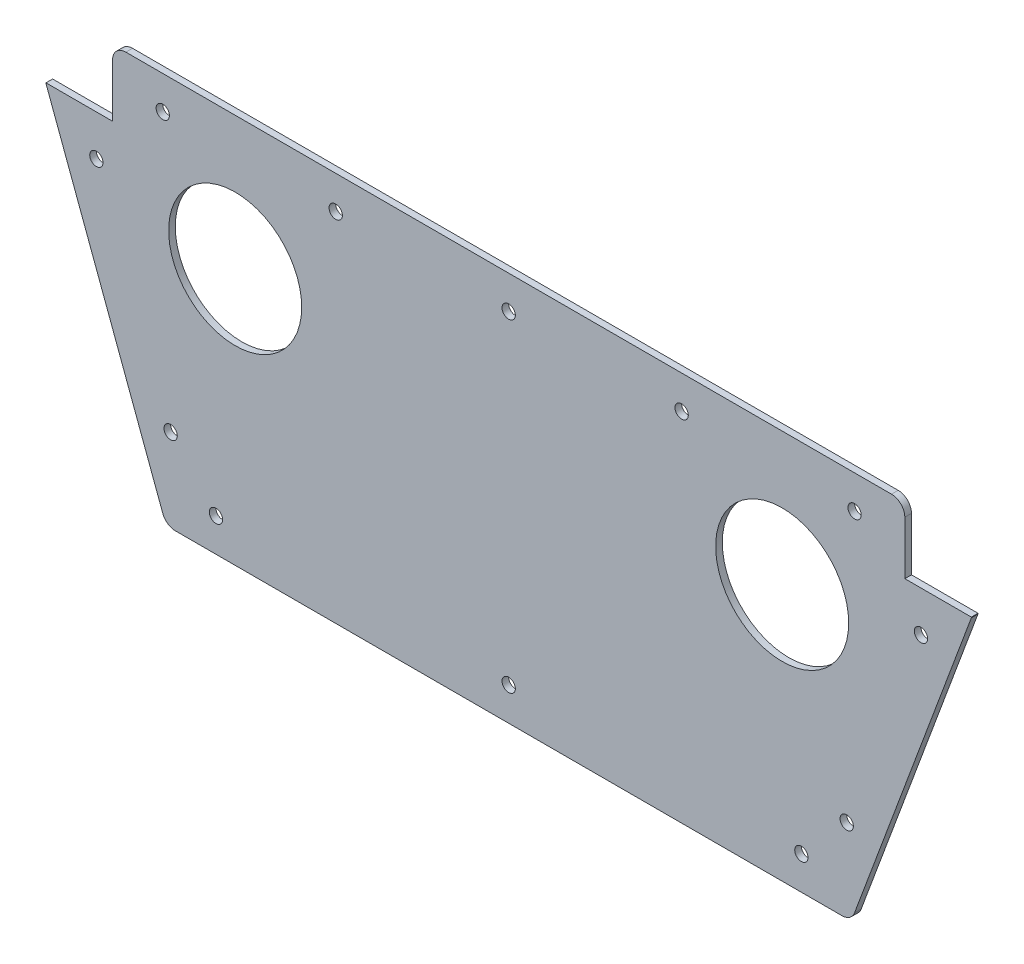
ISO-10303-21;
HEADER;
FILE_DESCRIPTION(('STEP AP214'),'2;1');
FILE_NAME('part.step','',(''),(''),'','','');
FILE_SCHEMA(('AUTOMOTIVE_DESIGN { 1 0 10303 214 1 1 1 1 }'));
ENDSEC;
DATA;
#1=APPLICATION_CONTEXT('core data for automotive mechanical design processes');
#2=APPLICATION_PROTOCOL_DEFINITION('international standard','automotive_design',2000,#1);
#3=PRODUCT_CONTEXT('',#1,'mechanical');
#4=PRODUCT('Part','Part','',(#3));
#5=PRODUCT_RELATED_PRODUCT_CATEGORY('part','',(#4));
#6=PRODUCT_DEFINITION_FORMATION('','',#4);
#7=PRODUCT_DEFINITION_CONTEXT('part definition',#1,'design');
#8=PRODUCT_DEFINITION('design','',#6,#7);
#9=PRODUCT_DEFINITION_SHAPE('','',#8);
#10=(LENGTH_UNIT() NAMED_UNIT(*) SI_UNIT(.MILLI.,.METRE.));
#11=(NAMED_UNIT(*) PLANE_ANGLE_UNIT() SI_UNIT($,.RADIAN.));
#12=(NAMED_UNIT(*) SI_UNIT($,.STERADIAN.) SOLID_ANGLE_UNIT());
#13=UNCERTAINTY_MEASURE_WITH_UNIT(LENGTH_MEASURE(1.E-05),#10,'distance_accuracy_value','');
#14=(GEOMETRIC_REPRESENTATION_CONTEXT(3) GLOBAL_UNCERTAINTY_ASSIGNED_CONTEXT((#13)) GLOBAL_UNIT_ASSIGNED_CONTEXT((#10,
#11,#12)) REPRESENTATION_CONTEXT('',''));
#15=CARTESIAN_POINT('',(0.,0.,0.));
#16=DIRECTION('',(0.,0.,1.));
#17=DIRECTION('',(1.,0.,0.));
#18=AXIS2_PLACEMENT_3D('',#15,#16,#17);
#19=CARTESIAN_POINT('',(-69.55,28.5,-1.));
#20=DIRECTION('',(-1.,0.,0.));
#21=DIRECTION('',(0.,0.,1.));
#22=AXIS2_PLACEMENT_3D('',#19,#20,#21);
#23=PLANE('',#22);
#24=DIRECTION('',(0.,0.,1.));
#25=VECTOR('',#24,1.);
#26=CARTESIAN_POINT('',(-69.55,28.6,-2.));
#27=LINE('',#26,#25);
#28=CARTESIAN_POINT('',(-69.55,28.6,-1.));
#29=VERTEX_POINT('',#28);
#30=CARTESIAN_POINT('',(-69.55,28.6,0.));
#31=VERTEX_POINT('',#30);
#32=EDGE_CURVE('E175',#29,#31,#27,.T.);
#33=ORIENTED_EDGE('',*,*,#32,.F.);
#34=DIRECTION('',(0.,-1.,0.));
#35=VECTOR('',#34,1.);
#36=CARTESIAN_POINT('',(-69.55,28.5,-1.));
#37=LINE('',#36,#35);
#38=CARTESIAN_POINT('',(-69.55,28.5,-1.));
#39=VERTEX_POINT('',#38);
#40=EDGE_CURVE('E256',#29,#39,#37,.T.);
#41=ORIENTED_EDGE('',*,*,#40,.T.);
#42=DIRECTION('',(0.,0.,1.));
#43=VECTOR('',#42,1.);
#44=CARTESIAN_POINT('',(-69.55,28.5,-1.));
#45=LINE('',#44,#43);
#46=CARTESIAN_POINT('',(-69.55,28.5,0.));
#47=VERTEX_POINT('',#46);
#48=EDGE_CURVE('E272',#39,#47,#45,.T.);
#49=ORIENTED_EDGE('',*,*,#48,.T.);
#50=DIRECTION('',(0.,-1.,0.));
#51=VECTOR('',#50,1.);
#52=CARTESIAN_POINT('',(-69.55,28.5,0.));
#53=LINE('',#52,#51);
#54=EDGE_CURVE('E255',#31,#47,#53,.T.);
#55=ORIENTED_EDGE('',*,*,#54,.F.);
#56=EDGE_LOOP('',(#33,#41,#49,#55));
#57=FACE_BOUND('',#56,.T.);
#58=ADVANCED_FACE('F36',(#57),#23,.T.);
#59=CARTESIAN_POINT('',(-69.55,38.6,-1.));
#60=DIRECTION('',(0.,1.,0.));
#61=DIRECTION('',(0.,0.,1.));
#62=AXIS2_PLACEMENT_3D('',#59,#60,#61);
#63=PLANE('',#62);
#64=DIRECTION('',(-1.,0.,0.));
#65=VECTOR('',#64,1.);
#66=CARTESIAN_POINT('',(-69.55,38.6,-1.));
#67=LINE('',#66,#65);
#68=CARTESIAN_POINT('',(57.55,38.6,-1.));
#69=VERTEX_POINT('',#68);
#70=CARTESIAN_POINT('',(-57.55,38.6,-1.));
#71=VERTEX_POINT('',#70);
#72=EDGE_CURVE('E269',#69,#71,#67,.T.);
#73=ORIENTED_EDGE('',*,*,#72,.T.);
#74=DIRECTION('',(0.,0.,1.));
#75=VECTOR('',#74,1.);
#76=CARTESIAN_POINT('',(-57.55,38.6,0.));
#77=LINE('',#76,#75);
#78=CARTESIAN_POINT('',(-57.55,38.6,0.));
#79=VERTEX_POINT('',#78);
#80=EDGE_CURVE('E291',#71,#79,#77,.T.);
#81=ORIENTED_EDGE('',*,*,#80,.T.);
#82=DIRECTION('',(-1.,0.,0.));
#83=VECTOR('',#82,1.);
#84=CARTESIAN_POINT('',(-69.55,38.6,0.));
#85=LINE('',#84,#83);
#86=CARTESIAN_POINT('',(57.55,38.6,0.));
#87=VERTEX_POINT('',#86);
#88=EDGE_CURVE('E259',#87,#79,#85,.T.);
#89=ORIENTED_EDGE('',*,*,#88,.F.);
#90=DIRECTION('',(0.,0.,1.));
#91=VECTOR('',#90,1.);
#92=CARTESIAN_POINT('',(57.55,38.6,-1.));
#93=LINE('',#92,#91);
#94=EDGE_CURVE('E287',#87,#69,#93,.F.);
#95=ORIENTED_EDGE('',*,*,#94,.T.);
#96=EDGE_LOOP('',(#73,#81,#89,#95));
#97=FACE_BOUND('',#96,.T.);
#98=ADVANCED_FACE('F360',(#97),#63,.T.);
#99=CARTESIAN_POINT('',(69.55,38.6,-1.));
#100=DIRECTION('',(1.,0.,0.));
#101=DIRECTION('',(0.,1.,0.));
#102=AXIS2_PLACEMENT_3D('',#99,#100,#101);
#103=PLANE('',#102);
#104=DIRECTION('',(0.,0.,1.));
#105=VECTOR('',#104,1.);
#106=CARTESIAN_POINT('',(69.55,28.6,-2.));
#107=LINE('',#106,#105);
#108=CARTESIAN_POINT('',(69.55,28.6,-1.));
#109=VERTEX_POINT('',#108);
#110=CARTESIAN_POINT('',(69.55,28.6,0.));
#111=VERTEX_POINT('',#110);
#112=EDGE_CURVE('E155',#109,#111,#107,.T.);
#113=ORIENTED_EDGE('',*,*,#112,.T.);
#114=DIRECTION('',(0.,1.,0.));
#115=VECTOR('',#114,1.);
#116=CARTESIAN_POINT('',(69.55,38.6,0.));
#117=LINE('',#116,#115);
#118=CARTESIAN_POINT('',(69.55,28.5,0.));
#119=VERTEX_POINT('',#118);
#120=EDGE_CURVE('E161',#119,#111,#117,.T.);
#121=ORIENTED_EDGE('',*,*,#120,.F.);
#122=DIRECTION('',(0.,0.,1.));
#123=VECTOR('',#122,1.);
#124=CARTESIAN_POINT('',(69.55,28.5,-1.));
#125=LINE('',#124,#123);
#126=CARTESIAN_POINT('',(69.55,28.5,-1.));
#127=VERTEX_POINT('',#126);
#128=EDGE_CURVE('E284',#127,#119,#125,.T.);
#129=ORIENTED_EDGE('',*,*,#128,.F.);
#130=DIRECTION('',(0.,1.,0.));
#131=VECTOR('',#130,1.);
#132=CARTESIAN_POINT('',(69.55,38.6,-1.));
#133=LINE('',#132,#131);
#134=EDGE_CURVE('E266',#127,#109,#133,.T.);
#135=ORIENTED_EDGE('',*,*,#134,.T.);
#136=EDGE_LOOP('',(#113,#121,#129,#135));
#137=FACE_BOUND('',#136,.T.);
#138=ADVANCED_FACE('F373',(#137),#103,.T.);
#139=CARTESIAN_POINT('',(69.55,28.5,-1.));
#140=DIRECTION('',(0.937199817406599,-0.348792921735858,0.));
#141=DIRECTION('',(0.348792921735858,0.937199817406599,0.));
#142=AXIS2_PLACEMENT_3D('',#139,#140,#141);
#143=PLANE('',#142);
#144=DIRECTION('',(0.348792921735858,0.937199817406599,0.));
#145=VECTOR('',#144,1.);
#146=CARTESIAN_POINT('',(69.55,28.5,0.));
#147=LINE('',#146,#145);
#148=CARTESIAN_POINT('',(51.9847128974296,-18.6975858434717,0.));
#149=VERTEX_POINT('',#148);
#150=EDGE_CURVE('E280',#149,#119,#147,.T.);
#151=ORIENTED_EDGE('',*,*,#150,.F.);
#152=DIRECTION('',(0.,0.,1.));
#153=VECTOR('',#152,1.);
#154=CARTESIAN_POINT('',(51.9847128974296,-18.6975858434717,-1.));
#155=LINE('',#154,#153);
#156=CARTESIAN_POINT('',(51.9847128974296,-18.6975858434717,-1.));
#157=VERTEX_POINT('',#156);
#158=EDGE_CURVE('E44',#149,#157,#155,.F.);
#159=ORIENTED_EDGE('',*,*,#158,.T.);
#160=DIRECTION('',(0.348792921735858,0.937199817406599,0.));
#161=VECTOR('',#160,1.);
#162=CARTESIAN_POINT('',(69.55,28.5,-1.));
#163=LINE('',#162,#161);
#164=EDGE_CURVE('E264',#157,#127,#163,.T.);
#165=ORIENTED_EDGE('',*,*,#164,.T.);
#166=ORIENTED_EDGE('',*,*,#128,.T.);
#167=EDGE_LOOP('',(#151,#159,#165,#166));
#168=FACE_BOUND('',#167,.T.);
#169=ADVANCED_FACE('F321',(#168),#143,.T.);
#170=CARTESIAN_POINT('',(51.5,-20.,-1.));
#171=DIRECTION('',(0.,-1.,0.));
#172=DIRECTION('',(1.,0.,0.));
#173=AXIS2_PLACEMENT_3D('',#170,#171,#172);
#174=PLANE('',#173);
#175=DIRECTION('',(1.,0.,0.));
#176=VECTOR('',#175,1.);
#177=CARTESIAN_POINT('',(51.5,-20.,0.));
#178=LINE('',#177,#176);
#179=CARTESIAN_POINT('',(-50.1103132626164,-20.,0.));
#180=VERTEX_POINT('',#179);
#181=CARTESIAN_POINT('',(50.1103132626164,-20.,0.));
#182=VERTEX_POINT('',#181);
#183=EDGE_CURVE('E277',#180,#182,#178,.T.);
#184=ORIENTED_EDGE('',*,*,#183,.F.);
#185=DIRECTION('',(0.,0.,1.));
#186=VECTOR('',#185,1.);
#187=CARTESIAN_POINT('',(-50.1103132626164,-20.,-1.));
#188=LINE('',#187,#186);
#189=CARTESIAN_POINT('',(-50.1103132626164,-20.,-1.));
#190=VERTEX_POINT('',#189);
#191=EDGE_CURVE('E316',#180,#190,#188,.F.);
#192=ORIENTED_EDGE('',*,*,#191,.T.);
#193=DIRECTION('',(1.,0.,0.));
#194=VECTOR('',#193,1.);
#195=CARTESIAN_POINT('',(51.5,-20.,-1.));
#196=LINE('',#195,#194);
#197=CARTESIAN_POINT('',(50.1103132626164,-20.,-1.));
#198=VERTEX_POINT('',#197);
#199=EDGE_CURVE('E261',#190,#198,#196,.T.);
#200=ORIENTED_EDGE('',*,*,#199,.T.);
#201=DIRECTION('',(0.,0.,1.));
#202=VECTOR('',#201,1.);
#203=CARTESIAN_POINT('',(50.1103132626164,-20.,-1.));
#204=LINE('',#203,#202);
#205=EDGE_CURVE('E313',#198,#182,#204,.T.);
#206=ORIENTED_EDGE('',*,*,#205,.T.);
#207=EDGE_LOOP('',(#184,#192,#200,#206));
#208=FACE_BOUND('',#207,.T.);
#209=ADVANCED_FACE('F333',(#208),#174,.T.);
#210=CARTESIAN_POINT('',(-51.5,-20.,-1.));
#211=DIRECTION('',(-0.937199817406599,-0.348792921735858,0.));
#212=DIRECTION('',(0.348792921735858,-0.9371998174066,0.));
#213=AXIS2_PLACEMENT_3D('',#210,#211,#212);
#214=PLANE('',#213);
#215=DIRECTION('',(0.348792921735858,-0.937199817406599,0.));
#216=VECTOR('',#215,1.);
#217=CARTESIAN_POINT('',(-51.5,-20.,-1.));
#218=LINE('',#217,#216);
#219=CARTESIAN_POINT('',(-51.9847128974296,-18.6975858434717,-1.));
#220=VERTEX_POINT('',#219);
#221=EDGE_CURVE('E258',#39,#220,#218,.T.);
#222=ORIENTED_EDGE('',*,*,#221,.T.);
#223=DIRECTION('',(0.,0.,1.));
#224=VECTOR('',#223,1.);
#225=CARTESIAN_POINT('',(-51.9847128974296,-18.6975858434717,-1.));
#226=LINE('',#225,#224);
#227=CARTESIAN_POINT('',(-51.9847128974296,-18.6975858434717,0.));
#228=VERTEX_POINT('',#227);
#229=EDGE_CURVE('E310',#220,#228,#226,.T.);
#230=ORIENTED_EDGE('',*,*,#229,.T.);
#231=DIRECTION('',(0.348792921735858,-0.937199817406599,0.));
#232=VECTOR('',#231,1.);
#233=CARTESIAN_POINT('',(-51.5,-20.,0.));
#234=LINE('',#233,#232);
#235=EDGE_CURVE('E274',#47,#228,#234,.T.);
#236=ORIENTED_EDGE('',*,*,#235,.F.);
#237=ORIENTED_EDGE('',*,*,#48,.F.);
#238=EDGE_LOOP('',(#222,#230,#236,#237));
#239=FACE_BOUND('',#238,.T.);
#240=ADVANCED_FACE('F340',(#239),#214,.T.);
#241=CARTESIAN_POINT('',(0.,0.,-1.));
#242=DIRECTION('',(0.,0.,-1.));
#243=DIRECTION('',(-1.,0.,0.));
#244=AXIS2_PLACEMENT_3D('',#241,#242,#243);
#245=PLANE('',#244);
#246=CARTESIAN_POINT('',(41.1129996513864,18.6,-1.));
#247=DIRECTION('',(0.,0.,-1.));
#248=DIRECTION('',(-1.,0.,0.));
#249=AXIS2_PLACEMENT_3D('',#246,#247,#248);
#250=CIRCLE('',#249,10.);
#251=CARTESIAN_POINT('',(31.1129996513864,18.6,-1.));
#252=VERTEX_POINT('',#251);
#253=EDGE_CURVE('E689',#252,#252,#250,.T.);
#254=ORIENTED_EDGE('',*,*,#253,.F.);
#255=EDGE_LOOP('',(#254));
#256=FACE_BOUND('',#255,.T.);
#257=CARTESIAN_POINT('',(-41.1129996513864,18.6,-1.));
#258=DIRECTION('',(0.,0.,-1.));
#259=DIRECTION('',(-1.,0.,0.));
#260=AXIS2_PLACEMENT_3D('',#257,#258,#259);
#261=CIRCLE('',#260,10.);
#262=CARTESIAN_POINT('',(-51.1129996513864,18.6,-1.));
#263=VERTEX_POINT('',#262);
#264=EDGE_CURVE('E148',#263,#263,#261,.T.);
#265=ORIENTED_EDGE('',*,*,#264,.F.);
#266=EDGE_LOOP('',(#265));
#267=FACE_BOUND('',#266,.T.);
#268=DIRECTION('',(0.,-1.,0.));
#269=VECTOR('',#268,1.);
#270=CARTESIAN_POINT('',(-59.55,0.,-1.));
#271=LINE('',#270,#269);
#272=CARTESIAN_POINT('',(-59.55,36.6,-1.));
#273=VERTEX_POINT('',#272);
#274=CARTESIAN_POINT('',(-59.55,28.6,-1.));
#275=VERTEX_POINT('',#274);
#276=EDGE_CURVE('E181',#273,#275,#271,.T.);
#277=ORIENTED_EDGE('',*,*,#276,.F.);
#278=CARTESIAN_POINT('',(-57.55,36.6,-1.));
#279=DIRECTION('',(0.,0.,-1.));
#280=DIRECTION('',(-1.,0.,0.));
#281=AXIS2_PLACEMENT_3D('',#278,#279,#280);
#282=CIRCLE('',#281,2.);
#283=EDGE_CURVE('E308',#273,#71,#282,.T.);
#284=ORIENTED_EDGE('',*,*,#283,.T.);
#285=ORIENTED_EDGE('',*,*,#72,.F.);
#286=CARTESIAN_POINT('',(57.55,36.6,-1.));
#287=DIRECTION('',(0.,0.,-1.));
#288=DIRECTION('',(-1.,0.,0.));
#289=AXIS2_PLACEMENT_3D('',#286,#287,#288);
#290=CIRCLE('',#289,2.);
#291=CARTESIAN_POINT('',(59.55,36.6,-1.));
#292=VERTEX_POINT('',#291);
#293=EDGE_CURVE('E51',#69,#292,#290,.T.);
#294=ORIENTED_EDGE('',*,*,#293,.T.);
#295=DIRECTION('',(0.,1.,0.));
#296=VECTOR('',#295,1.);
#297=CARTESIAN_POINT('',(59.55,0.,-1.));
#298=LINE('',#297,#296);
#299=CARTESIAN_POINT('',(59.55,28.6,-1.));
#300=VERTEX_POINT('',#299);
#301=EDGE_CURVE('E165',#300,#292,#298,.T.);
#302=ORIENTED_EDGE('',*,*,#301,.F.);
#303=DIRECTION('',(-1.,0.,0.));
#304=VECTOR('',#303,1.);
#305=CARTESIAN_POINT('',(0.,28.6,-1.));
#306=LINE('',#305,#304);
#307=EDGE_CURVE('E154',#109,#300,#306,.T.);
#308=ORIENTED_EDGE('',*,*,#307,.F.);
#309=ORIENTED_EDGE('',*,*,#134,.F.);
#310=ORIENTED_EDGE('',*,*,#164,.F.);
#311=CARTESIAN_POINT('',(50.1103132626164,-18.,-1.));
#312=DIRECTION('',(0.,0.,-1.));
#313=DIRECTION('',(-1.,0.,0.));
#314=AXIS2_PLACEMENT_3D('',#311,#312,#313);
#315=CIRCLE('',#314,2.);
#316=EDGE_CURVE('E305',#157,#198,#315,.T.);
#317=ORIENTED_EDGE('',*,*,#316,.T.);
#318=ORIENTED_EDGE('',*,*,#199,.F.);
#319=CARTESIAN_POINT('',(-50.1103132626164,-18.,-1.));
#320=DIRECTION('',(0.,0.,-1.));
#321=DIRECTION('',(-1.,0.,0.));
#322=AXIS2_PLACEMENT_3D('',#319,#320,#321);
#323=CIRCLE('',#322,2.);
#324=EDGE_CURVE('E58',#190,#220,#323,.T.);
#325=ORIENTED_EDGE('',*,*,#324,.T.);
#326=ORIENTED_EDGE('',*,*,#221,.F.);
#327=ORIENTED_EDGE('',*,*,#40,.F.);
#328=DIRECTION('',(-1.,0.,0.));
#329=VECTOR('',#328,1.);
#330=CARTESIAN_POINT('',(0.,28.6,-1.));
#331=LINE('',#330,#329);
#332=EDGE_CURVE('E178',#275,#29,#331,.T.);
#333=ORIENTED_EDGE('',*,*,#332,.F.);
#334=EDGE_LOOP('',(#277,#284,#285,#294,#302,#308,#309,#310,#317,#318,#325,#326,#327,#333));
#335=FACE_BOUND('',#334,.T.);
#336=CARTESIAN_POINT('',(50.8161265304279,-7.50240146074719,-1.));
#337=DIRECTION('',(0.,0.,-1.));
#338=DIRECTION('',(-1.,0.,0.));
#339=AXIS2_PLACEMENT_3D('',#336,#337,#338);
#340=CIRCLE('',#339,0.999999999999998);
#341=CARTESIAN_POINT('',(49.8161265304279,-7.50240146074719,-1.));
#342=VERTEX_POINT('',#341);
#343=EDGE_CURVE('E186',#342,#342,#340,.T.);
#344=ORIENTED_EDGE('',*,*,#343,.F.);
#345=EDGE_LOOP('',(#344));
#346=FACE_BOUND('',#345,.T.);
#347=CARTESIAN_POINT('',(61.9775000259753,22.487992696264,-1.));
#348=DIRECTION('',(0.,0.,-1.));
#349=DIRECTION('',(-1.,0.,0.));
#350=AXIS2_PLACEMENT_3D('',#347,#348,#349);
#351=CIRCLE('',#350,0.999999999999998);
#352=CARTESIAN_POINT('',(60.9775000259753,22.487992696264,-1.));
#353=VERTEX_POINT('',#352);
#354=EDGE_CURVE('E192',#353,#353,#351,.T.);
#355=ORIENTED_EDGE('',*,*,#354,.F.);
#356=EDGE_LOOP('',(#355));
#357=FACE_BOUND('',#356,.T.);
#358=CARTESIAN_POINT('',(52.,33.6,-1.));
#359=DIRECTION('',(0.,0.,-1.));
#360=DIRECTION('',(-1.,0.,0.));
#361=AXIS2_PLACEMENT_3D('',#358,#359,#360);
#362=CIRCLE('',#361,0.999999999999998);
#363=CARTESIAN_POINT('',(51.,33.6,-1.));
#364=VERTEX_POINT('',#363);
#365=EDGE_CURVE('E198',#364,#364,#362,.T.);
#366=ORIENTED_EDGE('',*,*,#365,.F.);
#367=EDGE_LOOP('',(#366));
#368=FACE_BOUND('',#367,.T.);
#369=CARTESIAN_POINT('',(26.,33.6,-1.));
#370=DIRECTION('',(0.,0.,-1.));
#371=DIRECTION('',(-1.,0.,0.));
#372=AXIS2_PLACEMENT_3D('',#369,#370,#371);
#373=CIRCLE('',#372,1.);
#374=CARTESIAN_POINT('',(25.,33.6,-1.));
#375=VERTEX_POINT('',#374);
#376=EDGE_CURVE('E204',#375,#375,#373,.T.);
#377=ORIENTED_EDGE('',*,*,#376,.F.);
#378=EDGE_LOOP('',(#377));
#379=FACE_BOUND('',#378,.T.);
#380=CARTESIAN_POINT('',(-52.,33.6,-1.));
#381=DIRECTION('',(0.,0.,-1.));
#382=DIRECTION('',(-1.,0.,0.));
#383=AXIS2_PLACEMENT_3D('',#380,#381,#382);
#384=CIRCLE('',#383,0.999999999999998);
#385=CARTESIAN_POINT('',(-53.,33.6,-1.));
#386=VERTEX_POINT('',#385);
#387=EDGE_CURVE('E210',#386,#386,#384,.T.);
#388=ORIENTED_EDGE('',*,*,#387,.F.);
#389=EDGE_LOOP('',(#388));
#390=FACE_BOUND('',#389,.T.);
#391=CARTESIAN_POINT('',(-26.,33.6,-1.));
#392=DIRECTION('',(0.,0.,-1.));
#393=DIRECTION('',(-1.,0.,0.));
#394=AXIS2_PLACEMENT_3D('',#391,#392,#393);
#395=CIRCLE('',#394,1.);
#396=CARTESIAN_POINT('',(-27.,33.6,-1.));
#397=VERTEX_POINT('',#396);
#398=EDGE_CURVE('E216',#397,#397,#395,.T.);
#399=ORIENTED_EDGE('',*,*,#398,.F.);
#400=EDGE_LOOP('',(#399));
#401=FACE_BOUND('',#400,.T.);
#402=CARTESIAN_POINT('',(0.,33.6,-1.));
#403=DIRECTION('',(0.,0.,-1.));
#404=DIRECTION('',(-1.,0.,0.));
#405=AXIS2_PLACEMENT_3D('',#402,#403,#404);
#406=CIRCLE('',#405,1.);
#407=CARTESIAN_POINT('',(-1.,33.6,-1.));
#408=VERTEX_POINT('',#407);
#409=EDGE_CURVE('E222',#408,#408,#406,.T.);
#410=ORIENTED_EDGE('',*,*,#409,.F.);
#411=EDGE_LOOP('',(#410));
#412=FACE_BOUND('',#411,.T.);
#413=CARTESIAN_POINT('',(-61.9775000259753,22.487992696264,-1.));
#414=DIRECTION('',(0.,0.,-1.));
#415=DIRECTION('',(-1.,0.,0.));
#416=AXIS2_PLACEMENT_3D('',#413,#414,#415);
#417=CIRCLE('',#416,0.999999999999998);
#418=CARTESIAN_POINT('',(-62.9775000259753,22.487992696264,-1.));
#419=VERTEX_POINT('',#418);
#420=EDGE_CURVE('E228',#419,#419,#417,.T.);
#421=ORIENTED_EDGE('',*,*,#420,.F.);
#422=EDGE_LOOP('',(#421));
#423=FACE_BOUND('',#422,.T.);
#424=CARTESIAN_POINT('',(-50.8161265304278,-7.5024014607472,-1.));
#425=DIRECTION('',(0.,0.,-1.));
#426=DIRECTION('',(-1.,0.,0.));
#427=AXIS2_PLACEMENT_3D('',#424,#425,#426);
#428=CIRCLE('',#427,0.999999999999998);
#429=CARTESIAN_POINT('',(-51.8161265304278,-7.5024014607472,-1.));
#430=VERTEX_POINT('',#429);
#431=EDGE_CURVE('E234',#430,#430,#428,.T.);
#432=ORIENTED_EDGE('',*,*,#431,.F.);
#433=EDGE_LOOP('',(#432));
#434=FACE_BOUND('',#433,.T.);
#435=CARTESIAN_POINT('',(-44.,-15.,-1.));
#436=DIRECTION('',(0.,0.,-1.));
#437=DIRECTION('',(-1.,0.,0.));
#438=AXIS2_PLACEMENT_3D('',#435,#436,#437);
#439=CIRCLE('',#438,0.999999999999998);
#440=CARTESIAN_POINT('',(-45.,-15.,-1.));
#441=VERTEX_POINT('',#440);
#442=EDGE_CURVE('E240',#441,#441,#439,.T.);
#443=ORIENTED_EDGE('',*,*,#442,.F.);
#444=EDGE_LOOP('',(#443));
#445=FACE_BOUND('',#444,.T.);
#446=CARTESIAN_POINT('',(44.,-15.,-1.));
#447=DIRECTION('',(0.,0.,-1.));
#448=DIRECTION('',(-1.,0.,0.));
#449=AXIS2_PLACEMENT_3D('',#446,#447,#448);
#450=CIRCLE('',#449,0.999999999999998);
#451=CARTESIAN_POINT('',(43.,-15.,-1.));
#452=VERTEX_POINT('',#451);
#453=EDGE_CURVE('E246',#452,#452,#450,.T.);
#454=ORIENTED_EDGE('',*,*,#453,.F.);
#455=EDGE_LOOP('',(#454));
#456=FACE_BOUND('',#455,.T.);
#457=CARTESIAN_POINT('',(0.,-15.,-1.));
#458=DIRECTION('',(0.,0.,-1.));
#459=DIRECTION('',(-1.,0.,0.));
#460=AXIS2_PLACEMENT_3D('',#457,#458,#459);
#461=CIRCLE('',#460,1.);
#462=CARTESIAN_POINT('',(-1.,-15.,-1.));
#463=VERTEX_POINT('',#462);
#464=EDGE_CURVE('E252',#463,#463,#461,.T.);
#465=ORIENTED_EDGE('',*,*,#464,.F.);
#466=EDGE_LOOP('',(#465));
#467=FACE_BOUND('',#466,.T.);
#468=ADVANCED_FACE('F327',(#256,#267,#335,#346,#357,#368,#379,#390,#401,#412,#423,#434,#445,
#456,#467),#245,.T.);
#469=CARTESIAN_POINT('',(0.,0.,0.));
#470=DIRECTION('',(0.,0.,-1.));
#471=DIRECTION('',(-1.,0.,0.));
#472=AXIS2_PLACEMENT_3D('',#469,#470,#471);
#473=PLANE('',#472);
#474=CARTESIAN_POINT('',(41.1129996513864,18.6,0.));
#475=DIRECTION('',(0.,0.,1.));
#476=DIRECTION('',(1.,0.,0.));
#477=AXIS2_PLACEMENT_3D('',#474,#475,#476);
#478=CIRCLE('',#477,10.);
#479=CARTESIAN_POINT('',(51.1129996513864,18.6,0.));
#480=VERTEX_POINT('',#479);
#481=EDGE_CURVE('E697',#480,#480,#478,.T.);
#482=ORIENTED_EDGE('',*,*,#481,.F.);
#483=EDGE_LOOP('',(#482));
#484=FACE_BOUND('',#483,.T.);
#485=CARTESIAN_POINT('',(-41.1129996513864,18.6,0.));
#486=DIRECTION('',(0.,0.,1.));
#487=DIRECTION('',(1.,0.,0.));
#488=AXIS2_PLACEMENT_3D('',#485,#486,#487);
#489=CIRCLE('',#488,10.);
#490=CARTESIAN_POINT('',(-31.1129996513863,18.6,0.));
#491=VERTEX_POINT('',#490);
#492=EDGE_CURVE('E692',#491,#491,#489,.T.);
#493=ORIENTED_EDGE('',*,*,#492,.F.);
#494=EDGE_LOOP('',(#493));
#495=FACE_BOUND('',#494,.T.);
#496=CARTESIAN_POINT('',(50.8161265304279,-7.50240146074719,0.));
#497=DIRECTION('',(0.,0.,1.));
#498=DIRECTION('',(1.,0.,0.));
#499=AXIS2_PLACEMENT_3D('',#496,#497,#498);
#500=CIRCLE('',#499,0.999999999999998);
#501=CARTESIAN_POINT('',(51.8161265304279,-7.50240146074719,0.));
#502=VERTEX_POINT('',#501);
#503=EDGE_CURVE('E183',#502,#502,#500,.T.);
#504=ORIENTED_EDGE('',*,*,#503,.F.);
#505=EDGE_LOOP('',(#504));
#506=FACE_BOUND('',#505,.T.);
#507=CARTESIAN_POINT('',(61.9775000259753,22.487992696264,0.));
#508=DIRECTION('',(0.,0.,1.));
#509=DIRECTION('',(1.,0.,0.));
#510=AXIS2_PLACEMENT_3D('',#507,#508,#509);
#511=CIRCLE('',#510,0.999999999999998);
#512=CARTESIAN_POINT('',(62.9775000259753,22.487992696264,0.));
#513=VERTEX_POINT('',#512);
#514=EDGE_CURVE('E189',#513,#513,#511,.T.);
#515=ORIENTED_EDGE('',*,*,#514,.F.);
#516=EDGE_LOOP('',(#515));
#517=FACE_BOUND('',#516,.T.);
#518=CARTESIAN_POINT('',(52.,33.6,0.));
#519=DIRECTION('',(0.,0.,1.));
#520=DIRECTION('',(1.,0.,0.));
#521=AXIS2_PLACEMENT_3D('',#518,#519,#520);
#522=CIRCLE('',#521,0.999999999999998);
#523=CARTESIAN_POINT('',(53.,33.6,0.));
#524=VERTEX_POINT('',#523);
#525=EDGE_CURVE('E195',#524,#524,#522,.T.);
#526=ORIENTED_EDGE('',*,*,#525,.F.);
#527=EDGE_LOOP('',(#526));
#528=FACE_BOUND('',#527,.T.);
#529=CARTESIAN_POINT('',(26.,33.6,0.));
#530=DIRECTION('',(0.,0.,1.));
#531=DIRECTION('',(1.,0.,0.));
#532=AXIS2_PLACEMENT_3D('',#529,#530,#531);
#533=CIRCLE('',#532,1.);
#534=CARTESIAN_POINT('',(27.,33.6,0.));
#535=VERTEX_POINT('',#534);
#536=EDGE_CURVE('E201',#535,#535,#533,.T.);
#537=ORIENTED_EDGE('',*,*,#536,.F.);
#538=EDGE_LOOP('',(#537));
#539=FACE_BOUND('',#538,.T.);
#540=CARTESIAN_POINT('',(-52.,33.6,0.));
#541=DIRECTION('',(0.,0.,1.));
#542=DIRECTION('',(1.,0.,0.));
#543=AXIS2_PLACEMENT_3D('',#540,#541,#542);
#544=CIRCLE('',#543,0.999999999999998);
#545=CARTESIAN_POINT('',(-51.,33.6,0.));
#546=VERTEX_POINT('',#545);
#547=EDGE_CURVE('E207',#546,#546,#544,.T.);
#548=ORIENTED_EDGE('',*,*,#547,.F.);
#549=EDGE_LOOP('',(#548));
#550=FACE_BOUND('',#549,.T.);
#551=CARTESIAN_POINT('',(-26.,33.6,0.));
#552=DIRECTION('',(0.,0.,1.));
#553=DIRECTION('',(1.,0.,0.));
#554=AXIS2_PLACEMENT_3D('',#551,#552,#553);
#555=CIRCLE('',#554,1.);
#556=CARTESIAN_POINT('',(-25.,33.6,0.));
#557=VERTEX_POINT('',#556);
#558=EDGE_CURVE('E213',#557,#557,#555,.T.);
#559=ORIENTED_EDGE('',*,*,#558,.F.);
#560=EDGE_LOOP('',(#559));
#561=FACE_BOUND('',#560,.T.);
#562=CARTESIAN_POINT('',(0.,33.6,0.));
#563=DIRECTION('',(0.,0.,1.));
#564=DIRECTION('',(1.,0.,0.));
#565=AXIS2_PLACEMENT_3D('',#562,#563,#564);
#566=CIRCLE('',#565,1.);
#567=CARTESIAN_POINT('',(1.,33.6,0.));
#568=VERTEX_POINT('',#567);
#569=EDGE_CURVE('E219',#568,#568,#566,.T.);
#570=ORIENTED_EDGE('',*,*,#569,.F.);
#571=EDGE_LOOP('',(#570));
#572=FACE_BOUND('',#571,.T.);
#573=CARTESIAN_POINT('',(-61.9775000259753,22.487992696264,0.));
#574=DIRECTION('',(0.,0.,1.));
#575=DIRECTION('',(1.,0.,0.));
#576=AXIS2_PLACEMENT_3D('',#573,#574,#575);
#577=CIRCLE('',#576,0.999999999999998);
#578=CARTESIAN_POINT('',(-60.9775000259753,22.487992696264,0.));
#579=VERTEX_POINT('',#578);
#580=EDGE_CURVE('E225',#579,#579,#577,.T.);
#581=ORIENTED_EDGE('',*,*,#580,.F.);
#582=EDGE_LOOP('',(#581));
#583=FACE_BOUND('',#582,.T.);
#584=CARTESIAN_POINT('',(-50.8161265304278,-7.5024014607472,0.));
#585=DIRECTION('',(0.,0.,1.));
#586=DIRECTION('',(1.,0.,0.));
#587=AXIS2_PLACEMENT_3D('',#584,#585,#586);
#588=CIRCLE('',#587,0.999999999999998);
#589=CARTESIAN_POINT('',(-49.8161265304278,-7.5024014607472,0.));
#590=VERTEX_POINT('',#589);
#591=EDGE_CURVE('E231',#590,#590,#588,.T.);
#592=ORIENTED_EDGE('',*,*,#591,.F.);
#593=EDGE_LOOP('',(#592));
#594=FACE_BOUND('',#593,.T.);
#595=CARTESIAN_POINT('',(-44.,-15.,0.));
#596=DIRECTION('',(0.,0.,1.));
#597=DIRECTION('',(1.,0.,0.));
#598=AXIS2_PLACEMENT_3D('',#595,#596,#597);
#599=CIRCLE('',#598,0.999999999999998);
#600=CARTESIAN_POINT('',(-43.,-15.,0.));
#601=VERTEX_POINT('',#600);
#602=EDGE_CURVE('E237',#601,#601,#599,.T.);
#603=ORIENTED_EDGE('',*,*,#602,.F.);
#604=EDGE_LOOP('',(#603));
#605=FACE_BOUND('',#604,.T.);
#606=CARTESIAN_POINT('',(44.,-15.,0.));
#607=DIRECTION('',(0.,0.,1.));
#608=DIRECTION('',(1.,0.,0.));
#609=AXIS2_PLACEMENT_3D('',#606,#607,#608);
#610=CIRCLE('',#609,0.999999999999998);
#611=CARTESIAN_POINT('',(45.,-15.,0.));
#612=VERTEX_POINT('',#611);
#613=EDGE_CURVE('E243',#612,#612,#610,.T.);
#614=ORIENTED_EDGE('',*,*,#613,.F.);
#615=EDGE_LOOP('',(#614));
#616=FACE_BOUND('',#615,.T.);
#617=CARTESIAN_POINT('',(0.,-15.,0.));
#618=DIRECTION('',(0.,0.,1.));
#619=DIRECTION('',(1.,0.,0.));
#620=AXIS2_PLACEMENT_3D('',#617,#618,#619);
#621=CIRCLE('',#620,1.);
#622=CARTESIAN_POINT('',(1.,-15.,0.));
#623=VERTEX_POINT('',#622);
#624=EDGE_CURVE('E249',#623,#623,#621,.T.);
#625=ORIENTED_EDGE('',*,*,#624,.F.);
#626=EDGE_LOOP('',(#625));
#627=FACE_BOUND('',#626,.T.);
#628=ORIENTED_EDGE('',*,*,#88,.T.);
#629=CARTESIAN_POINT('',(-57.55,36.6,0.));
#630=DIRECTION('',(0.,0.,-1.));
#631=DIRECTION('',(-1.,0.,0.));
#632=AXIS2_PLACEMENT_3D('',#629,#630,#631);
#633=CIRCLE('',#632,2.);
#634=CARTESIAN_POINT('',(-59.55,36.6,0.));
#635=VERTEX_POINT('',#634);
#636=EDGE_CURVE('E300',#79,#635,#633,.F.);
#637=ORIENTED_EDGE('',*,*,#636,.T.);
#638=DIRECTION('',(0.,1.,0.));
#639=VECTOR('',#638,1.);
#640=CARTESIAN_POINT('',(-59.55,38.6,0.));
#641=LINE('',#640,#639);
#642=CARTESIAN_POINT('',(-59.55,28.6,0.));
#643=VERTEX_POINT('',#642);
#644=EDGE_CURVE('E172',#643,#635,#641,.T.);
#645=ORIENTED_EDGE('',*,*,#644,.F.);
#646=DIRECTION('',(1.,0.,0.));
#647=VECTOR('',#646,1.);
#648=CARTESIAN_POINT('',(-69.55,28.6,0.));
#649=LINE('',#648,#647);
#650=EDGE_CURVE('E169',#31,#643,#649,.T.);
#651=ORIENTED_EDGE('',*,*,#650,.F.);
#652=ORIENTED_EDGE('',*,*,#54,.T.);
#653=ORIENTED_EDGE('',*,*,#235,.T.);
#654=CARTESIAN_POINT('',(-50.1103132626164,-18.,0.));
#655=DIRECTION('',(0.,0.,-1.));
#656=DIRECTION('',(-1.,0.,0.));
#657=AXIS2_PLACEMENT_3D('',#654,#655,#656);
#658=CIRCLE('',#657,2.);
#659=EDGE_CURVE('E298',#228,#180,#658,.F.);
#660=ORIENTED_EDGE('',*,*,#659,.T.);
#661=ORIENTED_EDGE('',*,*,#183,.T.);
#662=CARTESIAN_POINT('',(50.1103132626164,-18.,0.));
#663=DIRECTION('',(0.,0.,-1.));
#664=DIRECTION('',(-1.,0.,0.));
#665=AXIS2_PLACEMENT_3D('',#662,#663,#664);
#666=CIRCLE('',#665,2.);
#667=EDGE_CURVE('E296',#182,#149,#666,.F.);
#668=ORIENTED_EDGE('',*,*,#667,.T.);
#669=ORIENTED_EDGE('',*,*,#150,.T.);
#670=ORIENTED_EDGE('',*,*,#120,.T.);
#671=DIRECTION('',(1.,0.,0.));
#672=VECTOR('',#671,1.);
#673=CARTESIAN_POINT('',(69.55,28.6,0.));
#674=LINE('',#673,#672);
#675=CARTESIAN_POINT('',(59.55,28.6,0.));
#676=VERTEX_POINT('',#675);
#677=EDGE_CURVE('E147',#676,#111,#674,.T.);
#678=ORIENTED_EDGE('',*,*,#677,.F.);
#679=DIRECTION('',(0.,-1.,0.));
#680=VECTOR('',#679,1.);
#681=CARTESIAN_POINT('',(59.55,38.6,0.));
#682=LINE('',#681,#680);
#683=CARTESIAN_POINT('',(59.55,36.6,0.));
#684=VERTEX_POINT('',#683);
#685=EDGE_CURVE('E140',#684,#676,#682,.T.);
#686=ORIENTED_EDGE('',*,*,#685,.F.);
#687=CARTESIAN_POINT('',(57.55,36.6,0.));
#688=DIRECTION('',(0.,0.,-1.));
#689=DIRECTION('',(-1.,0.,0.));
#690=AXIS2_PLACEMENT_3D('',#687,#688,#689);
#691=CIRCLE('',#690,2.);
#692=EDGE_CURVE('E294',#684,#87,#691,.F.);
#693=ORIENTED_EDGE('',*,*,#692,.T.);
#694=EDGE_LOOP('',(#628,#637,#645,#651,#652,#653,#660,#661,#668,#669,#670,#678,#686,#693));
#695=FACE_BOUND('',#694,.T.);
#696=ADVANCED_FACE('F159',(#484,#495,#506,#517,#528,#539,#550,#561,#572,#583,#594,#605,#616,
#627,#695),#473,.F.);
#697=CARTESIAN_POINT('',(0.,-15.,-2.));
#698=DIRECTION('',(0.,0.,1.));
#699=DIRECTION('',(1.,0.,0.));
#700=AXIS2_PLACEMENT_3D('',#697,#698,#699);
#701=CYLINDRICAL_SURFACE('',#700,1.);
#702=ORIENTED_EDGE('',*,*,#464,.T.);
#703=EDGE_LOOP('',(#702));
#704=FACE_BOUND('',#703,.T.);
#705=ORIENTED_EDGE('',*,*,#624,.T.);
#706=EDGE_LOOP('',(#705));
#707=FACE_BOUND('',#706,.T.);
#708=ADVANCED_FACE('F581',(#704,#707),#701,.F.);
#709=CARTESIAN_POINT('',(44.,-15.,-2.));
#710=DIRECTION('',(0.,0.,1.));
#711=DIRECTION('',(1.,0.,0.));
#712=AXIS2_PLACEMENT_3D('',#709,#710,#711);
#713=CYLINDRICAL_SURFACE('',#712,0.999999999999998);
#714=ORIENTED_EDGE('',*,*,#453,.T.);
#715=EDGE_LOOP('',(#714));
#716=FACE_BOUND('',#715,.T.);
#717=ORIENTED_EDGE('',*,*,#613,.T.);
#718=EDGE_LOOP('',(#717));
#719=FACE_BOUND('',#718,.T.);
#720=ADVANCED_FACE('F570',(#716,#719),#713,.F.);
#721=CARTESIAN_POINT('',(-44.,-15.,-2.));
#722=DIRECTION('',(0.,0.,1.));
#723=DIRECTION('',(1.,0.,0.));
#724=AXIS2_PLACEMENT_3D('',#721,#722,#723);
#725=CYLINDRICAL_SURFACE('',#724,0.999999999999998);
#726=ORIENTED_EDGE('',*,*,#442,.T.);
#727=EDGE_LOOP('',(#726));
#728=FACE_BOUND('',#727,.T.);
#729=ORIENTED_EDGE('',*,*,#602,.T.);
#730=EDGE_LOOP('',(#729));
#731=FACE_BOUND('',#730,.T.);
#732=ADVANCED_FACE('F559',(#728,#731),#725,.F.);
#733=CARTESIAN_POINT('',(-50.8161265304278,-7.5024014607472,-2.));
#734=DIRECTION('',(0.,0.,1.));
#735=DIRECTION('',(1.,0.,0.));
#736=AXIS2_PLACEMENT_3D('',#733,#734,#735);
#737=CYLINDRICAL_SURFACE('',#736,0.999999999999998);
#738=ORIENTED_EDGE('',*,*,#431,.T.);
#739=EDGE_LOOP('',(#738));
#740=FACE_BOUND('',#739,.T.);
#741=ORIENTED_EDGE('',*,*,#591,.T.);
#742=EDGE_LOOP('',(#741));
#743=FACE_BOUND('',#742,.T.);
#744=ADVANCED_FACE('F548',(#740,#743),#737,.F.);
#745=CARTESIAN_POINT('',(-61.9775000259753,22.487992696264,-2.));
#746=DIRECTION('',(0.,0.,1.));
#747=DIRECTION('',(1.,0.,0.));
#748=AXIS2_PLACEMENT_3D('',#745,#746,#747);
#749=CYLINDRICAL_SURFACE('',#748,0.999999999999998);
#750=ORIENTED_EDGE('',*,*,#420,.T.);
#751=EDGE_LOOP('',(#750));
#752=FACE_BOUND('',#751,.T.);
#753=ORIENTED_EDGE('',*,*,#580,.T.);
#754=EDGE_LOOP('',(#753));
#755=FACE_BOUND('',#754,.T.);
#756=ADVANCED_FACE('F537',(#752,#755),#749,.F.);
#757=CARTESIAN_POINT('',(0.,33.6,-2.));
#758=DIRECTION('',(0.,0.,1.));
#759=DIRECTION('',(1.,0.,0.));
#760=AXIS2_PLACEMENT_3D('',#757,#758,#759);
#761=CYLINDRICAL_SURFACE('',#760,1.);
#762=ORIENTED_EDGE('',*,*,#409,.T.);
#763=EDGE_LOOP('',(#762));
#764=FACE_BOUND('',#763,.T.);
#765=ORIENTED_EDGE('',*,*,#569,.T.);
#766=EDGE_LOOP('',(#765));
#767=FACE_BOUND('',#766,.T.);
#768=ADVANCED_FACE('F526',(#764,#767),#761,.F.);
#769=CARTESIAN_POINT('',(-26.,33.6,-2.));
#770=DIRECTION('',(0.,0.,1.));
#771=DIRECTION('',(1.,0.,0.));
#772=AXIS2_PLACEMENT_3D('',#769,#770,#771);
#773=CYLINDRICAL_SURFACE('',#772,1.);
#774=ORIENTED_EDGE('',*,*,#398,.T.);
#775=EDGE_LOOP('',(#774));
#776=FACE_BOUND('',#775,.T.);
#777=ORIENTED_EDGE('',*,*,#558,.T.);
#778=EDGE_LOOP('',(#777));
#779=FACE_BOUND('',#778,.T.);
#780=ADVANCED_FACE('F515',(#776,#779),#773,.F.);
#781=CARTESIAN_POINT('',(-52.,33.6,-2.));
#782=DIRECTION('',(0.,0.,1.));
#783=DIRECTION('',(1.,0.,0.));
#784=AXIS2_PLACEMENT_3D('',#781,#782,#783);
#785=CYLINDRICAL_SURFACE('',#784,0.999999999999998);
#786=ORIENTED_EDGE('',*,*,#387,.T.);
#787=EDGE_LOOP('',(#786));
#788=FACE_BOUND('',#787,.T.);
#789=ORIENTED_EDGE('',*,*,#547,.T.);
#790=EDGE_LOOP('',(#789));
#791=FACE_BOUND('',#790,.T.);
#792=ADVANCED_FACE('F504',(#788,#791),#785,.F.);
#793=CARTESIAN_POINT('',(26.,33.6,-2.));
#794=DIRECTION('',(0.,0.,1.));
#795=DIRECTION('',(1.,0.,0.));
#796=AXIS2_PLACEMENT_3D('',#793,#794,#795);
#797=CYLINDRICAL_SURFACE('',#796,1.);
#798=ORIENTED_EDGE('',*,*,#376,.T.);
#799=EDGE_LOOP('',(#798));
#800=FACE_BOUND('',#799,.T.);
#801=ORIENTED_EDGE('',*,*,#536,.T.);
#802=EDGE_LOOP('',(#801));
#803=FACE_BOUND('',#802,.T.);
#804=ADVANCED_FACE('F493',(#800,#803),#797,.F.);
#805=CARTESIAN_POINT('',(52.,33.6,-2.));
#806=DIRECTION('',(0.,0.,1.));
#807=DIRECTION('',(1.,0.,0.));
#808=AXIS2_PLACEMENT_3D('',#805,#806,#807);
#809=CYLINDRICAL_SURFACE('',#808,0.999999999999998);
#810=ORIENTED_EDGE('',*,*,#365,.T.);
#811=EDGE_LOOP('',(#810));
#812=FACE_BOUND('',#811,.T.);
#813=ORIENTED_EDGE('',*,*,#525,.T.);
#814=EDGE_LOOP('',(#813));
#815=FACE_BOUND('',#814,.T.);
#816=ADVANCED_FACE('F482',(#812,#815),#809,.F.);
#817=CARTESIAN_POINT('',(61.9775000259753,22.487992696264,-2.));
#818=DIRECTION('',(0.,0.,1.));
#819=DIRECTION('',(1.,0.,0.));
#820=AXIS2_PLACEMENT_3D('',#817,#818,#819);
#821=CYLINDRICAL_SURFACE('',#820,0.999999999999998);
#822=ORIENTED_EDGE('',*,*,#354,.T.);
#823=EDGE_LOOP('',(#822));
#824=FACE_BOUND('',#823,.T.);
#825=ORIENTED_EDGE('',*,*,#514,.T.);
#826=EDGE_LOOP('',(#825));
#827=FACE_BOUND('',#826,.T.);
#828=ADVANCED_FACE('F471',(#824,#827),#821,.F.);
#829=CARTESIAN_POINT('',(50.8161265304279,-7.50240146074719,-2.));
#830=DIRECTION('',(0.,0.,1.));
#831=DIRECTION('',(1.,0.,0.));
#832=AXIS2_PLACEMENT_3D('',#829,#830,#831);
#833=CYLINDRICAL_SURFACE('',#832,0.999999999999998);
#834=ORIENTED_EDGE('',*,*,#343,.T.);
#835=EDGE_LOOP('',(#834));
#836=FACE_BOUND('',#835,.T.);
#837=ORIENTED_EDGE('',*,*,#503,.T.);
#838=EDGE_LOOP('',(#837));
#839=FACE_BOUND('',#838,.T.);
#840=ADVANCED_FACE('F461',(#836,#839),#833,.F.);
#841=CARTESIAN_POINT('',(-59.55,38.6,-2.));
#842=DIRECTION('',(1.,0.,0.));
#843=DIRECTION('',(0.,0.,-1.));
#844=AXIS2_PLACEMENT_3D('',#841,#842,#843);
#845=PLANE('',#844);
#846=ORIENTED_EDGE('',*,*,#644,.T.);
#847=DIRECTION('',(0.,0.,1.));
#848=VECTOR('',#847,1.);
#849=CARTESIAN_POINT('',(-59.55,36.6,-1.));
#850=LINE('',#849,#848);
#851=EDGE_CURVE('E302',#635,#273,#850,.F.);
#852=ORIENTED_EDGE('',*,*,#851,.T.);
#853=ORIENTED_EDGE('',*,*,#276,.T.);
#854=DIRECTION('',(0.,0.,1.));
#855=VECTOR('',#854,1.);
#856=CARTESIAN_POINT('',(-59.55,28.6,-2.));
#857=LINE('',#856,#855);
#858=EDGE_CURVE('E176',#275,#643,#857,.T.);
#859=ORIENTED_EDGE('',*,*,#858,.T.);
#860=EDGE_LOOP('',(#846,#852,#853,#859));
#861=FACE_BOUND('',#860,.T.);
#862=ADVANCED_FACE('F354',(#861),#845,.F.);
#863=CARTESIAN_POINT('',(-69.55,28.6,-2.));
#864=DIRECTION('',(0.,-1.,0.));
#865=DIRECTION('',(0.,0.,-1.));
#866=AXIS2_PLACEMENT_3D('',#863,#864,#865);
#867=PLANE('',#866);
#868=ORIENTED_EDGE('',*,*,#332,.T.);
#869=ORIENTED_EDGE('',*,*,#32,.T.);
#870=ORIENTED_EDGE('',*,*,#650,.T.);
#871=ORIENTED_EDGE('',*,*,#858,.F.);
#872=EDGE_LOOP('',(#868,#869,#870,#871));
#873=FACE_BOUND('',#872,.T.);
#874=ADVANCED_FACE('F349',(#873),#867,.F.);
#875=CARTESIAN_POINT('',(69.55,28.6,-2.));
#876=DIRECTION('',(0.,-1.,0.));
#877=DIRECTION('',(0.,0.,-1.));
#878=AXIS2_PLACEMENT_3D('',#875,#876,#877);
#879=PLANE('',#878);
#880=ORIENTED_EDGE('',*,*,#307,.T.);
#881=DIRECTION('',(0.,0.,1.));
#882=VECTOR('',#881,1.);
#883=CARTESIAN_POINT('',(59.55,28.6,-2.));
#884=LINE('',#883,#882);
#885=EDGE_CURVE('E143',#300,#676,#884,.T.);
#886=ORIENTED_EDGE('',*,*,#885,.T.);
#887=ORIENTED_EDGE('',*,*,#677,.T.);
#888=ORIENTED_EDGE('',*,*,#112,.F.);
#889=EDGE_LOOP('',(#880,#886,#887,#888));
#890=FACE_BOUND('',#889,.T.);
#891=ADVANCED_FACE('F151',(#890),#879,.F.);
#892=CARTESIAN_POINT('',(59.55,38.6,-2.));
#893=DIRECTION('',(-1.,0.,0.));
#894=DIRECTION('',(0.,0.,1.));
#895=AXIS2_PLACEMENT_3D('',#892,#893,#894);
#896=PLANE('',#895);
#897=ORIENTED_EDGE('',*,*,#301,.T.);
#898=DIRECTION('',(0.,0.,1.));
#899=VECTOR('',#898,1.);
#900=CARTESIAN_POINT('',(59.55,36.6,0.));
#901=LINE('',#900,#899);
#902=EDGE_CURVE('E11',#292,#684,#901,.T.);
#903=ORIENTED_EDGE('',*,*,#902,.T.);
#904=ORIENTED_EDGE('',*,*,#685,.T.);
#905=ORIENTED_EDGE('',*,*,#885,.F.);
#906=EDGE_LOOP('',(#897,#903,#904,#905));
#907=FACE_BOUND('',#906,.T.);
#908=ADVANCED_FACE('F142',(#907),#896,.F.);
#909=CARTESIAN_POINT('',(-41.1129996513864,18.6,-2.));
#910=DIRECTION('',(0.,0.,1.));
#911=DIRECTION('',(1.,0.,0.));
#912=AXIS2_PLACEMENT_3D('',#909,#910,#911);
#913=CYLINDRICAL_SURFACE('',#912,10.);
#914=ORIENTED_EDGE('',*,*,#264,.T.);
#915=EDGE_LOOP('',(#914));
#916=FACE_BOUND('',#915,.T.);
#917=ORIENTED_EDGE('',*,*,#492,.T.);
#918=EDGE_LOOP('',(#917));
#919=FACE_BOUND('',#918,.T.);
#920=ADVANCED_FACE('F412',(#916,#919),#913,.F.);
#921=CARTESIAN_POINT('',(41.1129996513864,18.6,-2.));
#922=DIRECTION('',(0.,0.,1.));
#923=DIRECTION('',(1.,0.,0.));
#924=AXIS2_PLACEMENT_3D('',#921,#922,#923);
#925=CYLINDRICAL_SURFACE('',#924,10.);
#926=ORIENTED_EDGE('',*,*,#253,.T.);
#927=EDGE_LOOP('',(#926));
#928=FACE_BOUND('',#927,.T.);
#929=ORIENTED_EDGE('',*,*,#481,.T.);
#930=EDGE_LOOP('',(#929));
#931=FACE_BOUND('',#930,.T.);
#932=ADVANCED_FACE('F380',(#928,#931),#925,.F.);
#933=CARTESIAN_POINT('',(-57.55,36.6,-1.));
#934=DIRECTION('',(0.,0.,-1.));
#935=DIRECTION('',(-1.,0.,0.));
#936=AXIS2_PLACEMENT_3D('',#933,#934,#935);
#937=CYLINDRICAL_SURFACE('',#936,2.);
#938=ORIENTED_EDGE('',*,*,#283,.F.);
#939=ORIENTED_EDGE('',*,*,#851,.F.);
#940=ORIENTED_EDGE('',*,*,#636,.F.);
#941=ORIENTED_EDGE('',*,*,#80,.F.);
#942=EDGE_LOOP('',(#938,#939,#940,#941));
#943=FACE_BOUND('',#942,.T.);
#944=ADVANCED_FACE('F357',(#943),#937,.T.);
#945=CARTESIAN_POINT('',(-50.1103132626164,-18.,-1.));
#946=DIRECTION('',(0.,0.,1.));
#947=DIRECTION('',(1.,0.,0.));
#948=AXIS2_PLACEMENT_3D('',#945,#946,#947);
#949=CYLINDRICAL_SURFACE('',#948,2.);
#950=ORIENTED_EDGE('',*,*,#324,.F.);
#951=ORIENTED_EDGE('',*,*,#191,.F.);
#952=ORIENTED_EDGE('',*,*,#659,.F.);
#953=ORIENTED_EDGE('',*,*,#229,.F.);
#954=EDGE_LOOP('',(#950,#951,#952,#953));
#955=FACE_BOUND('',#954,.T.);
#956=ADVANCED_FACE('F338',(#955),#949,.T.);
#957=CARTESIAN_POINT('',(50.1103132626164,-18.,-1.));
#958=DIRECTION('',(0.,0.,1.));
#959=DIRECTION('',(1.,0.,0.));
#960=AXIS2_PLACEMENT_3D('',#957,#958,#959);
#961=CYLINDRICAL_SURFACE('',#960,2.);
#962=ORIENTED_EDGE('',*,*,#316,.F.);
#963=ORIENTED_EDGE('',*,*,#158,.F.);
#964=ORIENTED_EDGE('',*,*,#667,.F.);
#965=ORIENTED_EDGE('',*,*,#205,.F.);
#966=EDGE_LOOP('',(#962,#963,#964,#965));
#967=FACE_BOUND('',#966,.T.);
#968=ADVANCED_FACE('F330',(#967),#961,.T.);
#969=CARTESIAN_POINT('',(57.55,36.6,-2.));
#970=DIRECTION('',(0.,0.,-1.));
#971=DIRECTION('',(-1.,0.,0.));
#972=AXIS2_PLACEMENT_3D('',#969,#970,#971);
#973=CYLINDRICAL_SURFACE('',#972,2.);
#974=ORIENTED_EDGE('',*,*,#293,.F.);
#975=ORIENTED_EDGE('',*,*,#94,.F.);
#976=ORIENTED_EDGE('',*,*,#692,.F.);
#977=ORIENTED_EDGE('',*,*,#902,.F.);
#978=EDGE_LOOP('',(#974,#975,#976,#977));
#979=FACE_BOUND('',#978,.T.);
#980=ADVANCED_FACE('F38',(#979),#973,.T.);
#981=CLOSED_SHELL('',(#58,#98,#138,#169,#209,#240,#468,#696,#708,#720,#732,#744,#756,#768,#780,
#792,#804,#816,#828,#840,#862,#874,#891,#908,#920,#932,#944,#956,#968,#980));
#982=MANIFOLD_SOLID_BREP('B2',#981);
#983=ADVANCED_BREP_SHAPE_REPRESENTATION('',(#18,#982),#14);
#984=SHAPE_DEFINITION_REPRESENTATION(#9,#983);
ENDSEC;
END-ISO-10303-21;
